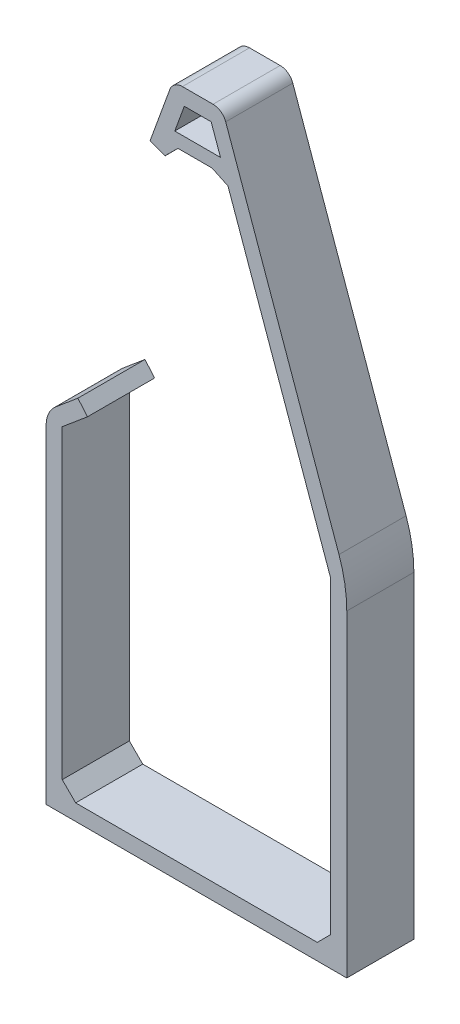
ISO-10303-21;
HEADER;
FILE_DESCRIPTION(('STEP AP214'),'2;1');
FILE_NAME('part.step','',(''),(''),'','','');
FILE_SCHEMA(('AUTOMOTIVE_DESIGN { 1 0 10303 214 1 1 1 1 }'));
ENDSEC;
DATA;
#1=APPLICATION_CONTEXT('core data for automotive mechanical design processes');
#2=APPLICATION_PROTOCOL_DEFINITION('international standard','automotive_design',2000,#1);
#3=PRODUCT_CONTEXT('',#1,'mechanical');
#4=PRODUCT('Part','Part','',(#3));
#5=PRODUCT_RELATED_PRODUCT_CATEGORY('part','',(#4));
#6=PRODUCT_DEFINITION_FORMATION('','',#4);
#7=PRODUCT_DEFINITION_CONTEXT('part definition',#1,'design');
#8=PRODUCT_DEFINITION('design','',#6,#7);
#9=PRODUCT_DEFINITION_SHAPE('','',#8);
#10=(LENGTH_UNIT() NAMED_UNIT(*) SI_UNIT(.MILLI.,.METRE.));
#11=(NAMED_UNIT(*) PLANE_ANGLE_UNIT() SI_UNIT($,.RADIAN.));
#12=(NAMED_UNIT(*) SI_UNIT($,.STERADIAN.) SOLID_ANGLE_UNIT());
#13=UNCERTAINTY_MEASURE_WITH_UNIT(LENGTH_MEASURE(1.E-05),#10,'distance_accuracy_value','');
#14=(GEOMETRIC_REPRESENTATION_CONTEXT(3) GLOBAL_UNCERTAINTY_ASSIGNED_CONTEXT((#13)) GLOBAL_UNIT_ASSIGNED_CONTEXT((#10,
#11,#12)) REPRESENTATION_CONTEXT('',''));
#15=CARTESIAN_POINT('',(0.,0.,0.));
#16=DIRECTION('',(0.,0.,1.));
#17=DIRECTION('',(1.,0.,0.));
#18=AXIS2_PLACEMENT_3D('',#15,#16,#17);
#19=CARTESIAN_POINT('',(-44.5218730063793,245.,25.));
#20=DIRECTION('',(-0.942030359041404,-0.335527648107162,0.));
#21=DIRECTION('',(0.335527648107162,-0.942030359041404,0.));
#22=AXIS2_PLACEMENT_3D('',#19,#20,#21);
#23=PLANE('',#22);
#24=DIRECTION('',(0.,0.,1.));
#25=VECTOR('',#24,1.);
#26=CARTESIAN_POINT('',(-41.0411868754266,235.227595179862,-21.2332268406788));
#27=LINE('',#26,#25);
#28=CARTESIAN_POINT('',(-41.0411868754266,235.227595179862,0.));
#29=VERTEX_POINT('',#28);
#30=CARTESIAN_POINT('',(-41.0411868754266,235.227595179862,25.));
#31=VERTEX_POINT('',#30);
#32=EDGE_CURVE('E302',#29,#31,#27,.T.);
#33=ORIENTED_EDGE('',*,*,#32,.T.);
#34=DIRECTION('',(-0.335527648107162,0.942030359041404,0.));
#35=VECTOR('',#34,1.);
#36=CARTESIAN_POINT('',(-44.5218730063793,245.,25.));
#37=LINE('',#36,#35);
#38=CARTESIAN_POINT('',(-44.5218730063793,245.,25.));
#39=VERTEX_POINT('',#38);
#40=EDGE_CURVE('E320',#31,#39,#37,.T.);
#41=ORIENTED_EDGE('',*,*,#40,.T.);
#42=DIRECTION('',(0.,0.,-1.));
#43=VECTOR('',#42,1.);
#44=CARTESIAN_POINT('',(-44.5218730063793,245.,25.));
#45=LINE('',#44,#43);
#46=CARTESIAN_POINT('',(-44.5218730063793,245.,0.));
#47=VERTEX_POINT('',#46);
#48=EDGE_CURVE('E354',#39,#47,#45,.T.);
#49=ORIENTED_EDGE('',*,*,#48,.T.);
#50=DIRECTION('',(-0.335527648107162,0.942030359041404,0.));
#51=VECTOR('',#50,1.);
#52=CARTESIAN_POINT('',(-44.5218730063793,245.,0.));
#53=LINE('',#52,#51);
#54=EDGE_CURVE('E337',#29,#47,#53,.T.);
#55=ORIENTED_EDGE('',*,*,#54,.F.);
#56=EDGE_LOOP('',(#33,#41,#49,#55));
#57=FACE_BOUND('',#56,.T.);
#58=ADVANCED_FACE('F73',(#57),#23,.T.);
#59=CARTESIAN_POINT('',(-100.,120.,25.));
#60=DIRECTION('',(0.939736472691457,-0.341899637164794,0.));
#61=DIRECTION('',(0.341899637164794,0.939736472691458,0.));
#62=AXIS2_PLACEMENT_3D('',#59,#60,#61);
#63=PLANE('',#62);
#64=DIRECTION('',(0.,0.,1.));
#65=VECTOR('',#64,1.);
#66=CARTESIAN_POINT('',(-58.0773183459256,235.227595179862,-21.2332268406788));
#67=LINE('',#66,#65);
#68=CARTESIAN_POINT('',(-58.0773183459256,235.227595179862,0.));
#69=VERTEX_POINT('',#68);
#70=CARTESIAN_POINT('',(-58.0773183459256,235.227595179862,25.));
#71=VERTEX_POINT('',#70);
#72=EDGE_CURVE('E296',#69,#71,#67,.T.);
#73=ORIENTED_EDGE('',*,*,#72,.F.);
#74=DIRECTION('',(-0.341899637164794,-0.939736472691457,0.));
#75=VECTOR('',#74,1.);
#76=CARTESIAN_POINT('',(-100.,120.,0.));
#77=LINE('',#76,#75);
#78=CARTESIAN_POINT('',(-54.5218730063793,245.,0.));
#79=VERTEX_POINT('',#78);
#80=EDGE_CURVE('E345',#79,#69,#77,.T.);
#81=ORIENTED_EDGE('',*,*,#80,.F.);
#82=DIRECTION('',(0.,0.,-1.));
#83=VECTOR('',#82,1.);
#84=CARTESIAN_POINT('',(-54.5218730063793,245.,25.));
#85=LINE('',#84,#83);
#86=CARTESIAN_POINT('',(-54.5218730063793,245.,25.));
#87=VERTEX_POINT('',#86);
#88=EDGE_CURVE('E335',#87,#79,#85,.T.);
#89=ORIENTED_EDGE('',*,*,#88,.F.);
#90=DIRECTION('',(-0.341899637164794,-0.939736472691457,0.));
#91=VECTOR('',#90,1.);
#92=CARTESIAN_POINT('',(-100.,120.,25.));
#93=LINE('',#92,#91);
#94=EDGE_CURVE('E328',#87,#71,#93,.T.);
#95=ORIENTED_EDGE('',*,*,#94,.T.);
#96=EDGE_LOOP('',(#73,#81,#89,#95));
#97=FACE_BOUND('',#96,.T.);
#98=ADVANCED_FACE('F570',(#97),#63,.T.);
#99=CARTESIAN_POINT('',(0.,0.,25.));
#100=DIRECTION('',(0.,0.,1.));
#101=DIRECTION('',(1.,0.,0.));
#102=AXIS2_PLACEMENT_3D('',#99,#100,#101);
#103=PLANE('',#102);
#104=ORIENTED_EDGE('',*,*,#40,.F.);
#105=DIRECTION('',(-1.,0.,0.));
#106=VECTOR('',#105,1.);
#107=CARTESIAN_POINT('',(-58.0773183459256,235.227595179862,25.));
#108=LINE('',#107,#106);
#109=EDGE_CURVE('E299',#31,#71,#108,.T.);
#110=ORIENTED_EDGE('',*,*,#109,.T.);
#111=ORIENTED_EDGE('',*,*,#94,.F.);
#112=DIRECTION('',(-1.,0.,0.));
#113=VECTOR('',#112,1.);
#114=CARTESIAN_POINT('',(-54.5218730063793,245.,25.));
#115=LINE('',#114,#113);
#116=EDGE_CURVE('E325',#39,#87,#115,.T.);
#117=ORIENTED_EDGE('',*,*,#116,.F.);
#118=EDGE_LOOP('',(#104,#110,#111,#117));
#119=FACE_BOUND('',#118,.T.);
#120=DIRECTION('',(-0.765962007675124,-0.642885839631184,0.));
#121=VECTOR('',#120,1.);
#122=CARTESIAN_POINT('',(-106.,121.057565216651,25.));
#123=LINE('',#122,#121);
#124=CARTESIAN_POINT('',(-94.163375331354,130.99225951252,25.));
#125=VERTEX_POINT('',#124);
#126=CARTESIAN_POINT('',(-102.428858396312,124.054889294509,25.));
#127=VERTEX_POINT('',#126);
#128=EDGE_CURVE('E271',#125,#127,#123,.T.);
#129=ORIENTED_EDGE('',*,*,#128,.T.);
#130=CARTESIAN_POINT('',(-96.,116.395269217758,25.));
#131=DIRECTION('',(0.,0.,1.));
#132=DIRECTION('',(1.,0.,0.));
#133=AXIS2_PLACEMENT_3D('',#130,#131,#132);
#134=CIRCLE('',#133,10.);
#135=CARTESIAN_POINT('',(-106.,116.395269217758,25.));
#136=VERTEX_POINT('',#135);
#137=EDGE_CURVE('E453',#127,#136,#134,.T.);
#138=ORIENTED_EDGE('',*,*,#137,.T.);
#139=DIRECTION('',(0.,-1.,0.));
#140=VECTOR('',#139,1.);
#141=CARTESIAN_POINT('',(-106.,0.,25.));
#142=LINE('',#141,#140);
#143=CARTESIAN_POINT('',(-106.,-6.00000000000001,25.));
#144=VERTEX_POINT('',#143);
#145=EDGE_CURVE('E373',#136,#144,#142,.T.);
#146=ORIENTED_EDGE('',*,*,#145,.T.);
#147=DIRECTION('',(1.,0.,0.));
#148=VECTOR('',#147,1.);
#149=CARTESIAN_POINT('',(0.,-6.,25.));
#150=LINE('',#149,#148);
#151=CARTESIAN_POINT('',(6.,-6.,25.));
#152=VERTEX_POINT('',#151);
#153=EDGE_CURVE('E375',#144,#152,#150,.T.);
#154=ORIENTED_EDGE('',*,*,#153,.T.);
#155=DIRECTION('',(0.,1.,0.));
#156=VECTOR('',#155,1.);
#157=CARTESIAN_POINT('',(6.,0.,25.));
#158=LINE('',#157,#156);
#159=CARTESIAN_POINT('',(6.,112.39805060308,25.));
#160=VERTEX_POINT('',#159);
#161=EDGE_CURVE('E361',#152,#160,#158,.T.);
#162=ORIENTED_EDGE('',*,*,#161,.T.);
#163=CARTESIAN_POINT('',(-44.,112.39805060308,25.));
#164=DIRECTION('',(0.,0.,1.));
#165=DIRECTION('',(1.,0.,0.));
#166=AXIS2_PLACEMENT_3D('',#163,#164,#165);
#167=CIRCLE('',#166,50.);
#168=CARTESIAN_POINT('',(3.10151795207019,129.174433008438,25.));
#169=VERTEX_POINT('',#168);
#170=EDGE_CURVE('E408',#160,#169,#167,.T.);
#171=ORIENTED_EDGE('',*,*,#170,.T.);
#172=DIRECTION('',(-0.335527648107162,0.942030359041404,0.));
#173=VECTOR('',#172,1.);
#174=CARTESIAN_POINT('',(43.5814498520134,15.5226222059618,25.));
#175=LINE('',#174,#173);
#176=CARTESIAN_POINT('',(-39.1063592814687,247.677638240536,25.));
#177=VERTEX_POINT('',#176);
#178=EDGE_CURVE('E364',#169,#177,#175,.T.);
#179=ORIENTED_EDGE('',*,*,#178,.T.);
#180=CARTESIAN_POINT('',(-43.8165110766757,246.,25.));
#181=DIRECTION('',(0.,0.,1.));
#182=DIRECTION('',(1.,0.,0.));
#183=AXIS2_PLACEMENT_3D('',#180,#181,#182);
#184=CIRCLE('',#183,5.);
#185=CARTESIAN_POINT('',(-43.8165110766757,251.,25.));
#186=VERTEX_POINT('',#185);
#187=EDGE_CURVE('E423',#177,#186,#184,.T.);
#188=ORIENTED_EDGE('',*,*,#187,.T.);
#189=DIRECTION('',(-1.,0.,0.));
#190=VECTOR('',#189,1.);
#191=CARTESIAN_POINT('',(0.,251.,25.));
#192=LINE('',#191,#190);
#193=CARTESIAN_POINT('',(-55.2221761040662,251.,25.));
#194=VERTEX_POINT('',#193);
#195=EDGE_CURVE('E368',#186,#194,#192,.T.);
#196=ORIENTED_EDGE('',*,*,#195,.T.);
#197=CARTESIAN_POINT('',(-55.2221761040662,246.,25.));
#198=DIRECTION('',(0.,0.,1.));
#199=DIRECTION('',(1.,0.,0.));
#200=AXIS2_PLACEMENT_3D('',#197,#198,#199);
#201=CIRCLE('',#200,5.);
#202=CARTESIAN_POINT('',(-59.9208584675235,247.709498185824,25.));
#203=VERTEX_POINT('',#202);
#204=EDGE_CURVE('E421',#194,#203,#201,.T.);
#205=ORIENTED_EDGE('',*,*,#204,.T.);
#206=DIRECTION('',(-0.341899637164794,-0.939736472691458,0.));
#207=VECTOR('',#206,1.);
#208=CARTESIAN_POINT('',(-132.504349732055,48.2083971545722,25.));
#209=LINE('',#208,#207);
#210=CARTESIAN_POINT('',(-67.2711825216207,227.506588182714,25.));
#211=VERTEX_POINT('',#210);
#212=EDGE_CURVE('E371',#203,#211,#209,.T.);
#213=ORIENTED_EDGE('',*,*,#212,.T.);
#214=DIRECTION('',(-0.939736472691457,0.341899637164794,0.));
#215=VECTOR('',#214,1.);
#216=CARTESIAN_POINT('',(-57.8738177947061,224.087591811066,25.));
#217=LINE('',#216,#215);
#218=CARTESIAN_POINT('',(-61.6327636854719,225.455190359725,25.));
#219=VERTEX_POINT('',#218);
#220=EDGE_CURVE('E311',#219,#211,#217,.T.);
#221=ORIENTED_EDGE('',*,*,#220,.F.);
#222=CARTESIAN_POINT('',(-61.612127121525,225.511911484008,25.));
#223=VERTEX_POINT('',#222);
#224=EDGE_CURVE('E327',#223,#219,#93,.T.);
#225=ORIENTED_EDGE('',*,*,#224,.F.);
#226=DIRECTION('',(-0.707106781186548,-0.707106781186547,0.));
#227=VECTOR('',#226,1.);
#228=CARTESIAN_POINT('',(-61.612127121525,225.511911484008,25.));
#229=LINE('',#228,#227);
#230=CARTESIAN_POINT('',(-56.8964434256704,230.227595179862,25.));
#231=VERTEX_POINT('',#230);
#232=EDGE_CURVE('E442',#223,#231,#229,.F.);
#233=ORIENTED_EDGE('',*,*,#232,.T.);
#234=DIRECTION('',(1.,0.,0.));
#235=VECTOR('',#234,1.);
#236=CARTESIAN_POINT('',(-39.2603119551714,230.227595179862,25.));
#237=LINE('',#236,#235);
#238=CARTESIAN_POINT('',(-44.206703695744,230.227595179862,25.));
#239=VERTEX_POINT('',#238);
#240=EDGE_CURVE('E291',#231,#239,#237,.T.);
#241=ORIENTED_EDGE('',*,*,#240,.T.);
#242=DIRECTION('',(-0.903369930213925,0.428862179709622,0.));
#243=VECTOR('',#242,1.);
#244=CARTESIAN_POINT('',(-44.206703695744,230.227595179862,25.));
#245=LINE('',#244,#243);
#246=CARTESIAN_POINT('',(-38.2537290108499,227.401504102738,25.));
#247=VERTEX_POINT('',#246);
#248=EDGE_CURVE('E438',#239,#247,#245,.F.);
#249=ORIENTED_EDGE('',*,*,#248,.T.);
#250=CARTESIAN_POINT('',(0.,120.,25.));
#251=VERTEX_POINT('',#250);
#252=EDGE_CURVE('E322',#251,#247,#37,.T.);
#253=ORIENTED_EDGE('',*,*,#252,.F.);
#254=DIRECTION('',(0.,1.,0.));
#255=VECTOR('',#254,1.);
#256=CARTESIAN_POINT('',(0.,0.,25.));
#257=LINE('',#256,#255);
#258=CARTESIAN_POINT('',(0.,5.,25.));
#259=VERTEX_POINT('',#258);
#260=EDGE_CURVE('E318',#259,#251,#257,.T.);
#261=ORIENTED_EDGE('',*,*,#260,.F.);
#262=DIRECTION('',(0.707106781186551,0.707106781186544,0.));
#263=VECTOR('',#262,1.);
#264=CARTESIAN_POINT('',(-5.00000000000006,0.,25.));
#265=LINE('',#264,#263);
#266=CARTESIAN_POINT('',(-5.00000000000006,0.,25.));
#267=VERTEX_POINT('',#266);
#268=EDGE_CURVE('E466',#259,#267,#265,.F.);
#269=ORIENTED_EDGE('',*,*,#268,.T.);
#270=DIRECTION('',(1.,0.,0.));
#271=VECTOR('',#270,1.);
#272=CARTESIAN_POINT('',(0.,0.,25.));
#273=LINE('',#272,#271);
#274=CARTESIAN_POINT('',(-95.,0.,25.));
#275=VERTEX_POINT('',#274);
#276=EDGE_CURVE('E332',#275,#267,#273,.T.);
#277=ORIENTED_EDGE('',*,*,#276,.F.);
#278=DIRECTION('',(0.707106781186544,-0.707106781186551,0.));
#279=VECTOR('',#278,1.);
#280=CARTESIAN_POINT('',(-100.,5.00000000000002,25.));
#281=LINE('',#280,#279);
#282=CARTESIAN_POINT('',(-100.,5.00000000000002,25.));
#283=VERTEX_POINT('',#282);
#284=EDGE_CURVE('E12',#275,#283,#281,.F.);
#285=ORIENTED_EDGE('',*,*,#284,.T.);
#286=DIRECTION('',(0.,-1.,0.));
#287=VECTOR('',#286,1.);
#288=CARTESIAN_POINT('',(-100.,0.,25.));
#289=LINE('',#288,#287);
#290=CARTESIAN_POINT('',(-100.,118.874615120958,25.));
#291=VERTEX_POINT('',#290);
#292=EDGE_CURVE('E281',#291,#283,#289,.T.);
#293=ORIENTED_EDGE('',*,*,#292,.F.);
#294=DIRECTION('',(0.765962007675123,0.642885839631186,0.));
#295=VECTOR('',#294,1.);
#296=CARTESIAN_POINT('',(-90.6086204503863,126.756970729396,25.));
#297=LINE('',#296,#295);
#298=CARTESIAN_POINT('',(-90.6086204503863,126.756970729396,25.));
#299=VERTEX_POINT('',#298);
#300=EDGE_CURVE('E265',#291,#299,#297,.T.);
#301=ORIENTED_EDGE('',*,*,#300,.T.);
#302=DIRECTION('',(-0.642885839631183,0.765962007675125,0.));
#303=VECTOR('',#302,1.);
#304=CARTESIAN_POINT('',(-94.163375331354,130.99225951252,25.));
#305=LINE('',#304,#303);
#306=EDGE_CURVE('E274',#299,#125,#305,.T.);
#307=ORIENTED_EDGE('',*,*,#306,.T.);
#308=EDGE_LOOP('',(#129,#138,#146,#154,#162,#171,#179,#188,#196,#205,#213,#221,#225,#233,#241,
#249,#253,#261,#269,#277,#285,#293,#301,#307));
#309=FACE_BOUND('',#308,.T.);
#310=ADVANCED_FACE('F280',(#119,#309),#103,.T.);
#311=CARTESIAN_POINT('',(0.,0.,0.));
#312=DIRECTION('',(0.,0.,1.));
#313=DIRECTION('',(1.,0.,0.));
#314=AXIS2_PLACEMENT_3D('',#311,#312,#313);
#315=PLANE('',#314);
#316=DIRECTION('',(0.,-1.,0.));
#317=VECTOR('',#316,1.);
#318=CARTESIAN_POINT('',(-106.,0.,0.));
#319=LINE('',#318,#317);
#320=CARTESIAN_POINT('',(-106.,116.395269217758,0.));
#321=VERTEX_POINT('',#320);
#322=CARTESIAN_POINT('',(-106.,-6.00000000000001,0.));
#323=VERTEX_POINT('',#322);
#324=EDGE_CURVE('E388',#321,#323,#319,.T.);
#325=ORIENTED_EDGE('',*,*,#324,.F.);
#326=CARTESIAN_POINT('',(-96.,116.395269217758,0.));
#327=DIRECTION('',(0.,0.,1.));
#328=DIRECTION('',(1.,0.,0.));
#329=AXIS2_PLACEMENT_3D('',#326,#327,#328);
#330=CIRCLE('',#329,10.);
#331=CARTESIAN_POINT('',(-102.428858396312,124.054889294509,0.));
#332=VERTEX_POINT('',#331);
#333=EDGE_CURVE('E449',#321,#332,#330,.F.);
#334=ORIENTED_EDGE('',*,*,#333,.T.);
#335=DIRECTION('',(0.765962007675124,0.642885839631184,0.));
#336=VECTOR('',#335,1.);
#337=CARTESIAN_POINT('',(-106.,121.057565216651,0.));
#338=LINE('',#337,#336);
#339=CARTESIAN_POINT('',(-94.163375331354,130.99225951252,0.));
#340=VERTEX_POINT('',#339);
#341=EDGE_CURVE('E284',#332,#340,#338,.T.);
#342=ORIENTED_EDGE('',*,*,#341,.T.);
#343=DIRECTION('',(0.642885839631183,-0.765962007675126,0.));
#344=VECTOR('',#343,1.);
#345=CARTESIAN_POINT('',(-94.163375331354,130.99225951252,0.));
#346=LINE('',#345,#344);
#347=CARTESIAN_POINT('',(-90.6086204503863,126.756970729396,0.));
#348=VERTEX_POINT('',#347);
#349=EDGE_CURVE('E288',#340,#348,#346,.T.);
#350=ORIENTED_EDGE('',*,*,#349,.T.);
#351=DIRECTION('',(-0.765962007675123,-0.642885839631186,0.));
#352=VECTOR('',#351,1.);
#353=CARTESIAN_POINT('',(-90.6086204503863,126.756970729396,0.));
#354=LINE('',#353,#352);
#355=CARTESIAN_POINT('',(-100.,118.874615120958,0.));
#356=VERTEX_POINT('',#355);
#357=EDGE_CURVE('E267',#348,#356,#354,.T.);
#358=ORIENTED_EDGE('',*,*,#357,.T.);
#359=DIRECTION('',(0.,-1.,0.));
#360=VECTOR('',#359,1.);
#361=CARTESIAN_POINT('',(-100.,0.,0.));
#362=LINE('',#361,#360);
#363=CARTESIAN_POINT('',(-100.,5.00000000000002,0.));
#364=VERTEX_POINT('',#363);
#365=EDGE_CURVE('E348',#356,#364,#362,.T.);
#366=ORIENTED_EDGE('',*,*,#365,.T.);
#367=DIRECTION('',(-0.707106781186544,0.707106781186551,0.));
#368=VECTOR('',#367,1.);
#369=CARTESIAN_POINT('',(-47.5000000000005,-47.5,0.));
#370=LINE('',#369,#368);
#371=CARTESIAN_POINT('',(-95.,0.,0.));
#372=VERTEX_POINT('',#371);
#373=EDGE_CURVE('E82',#364,#372,#370,.F.);
#374=ORIENTED_EDGE('',*,*,#373,.T.);
#375=DIRECTION('',(1.,0.,0.));
#376=VECTOR('',#375,1.);
#377=CARTESIAN_POINT('',(0.,0.,0.));
#378=LINE('',#377,#376);
#379=CARTESIAN_POINT('',(-5.00000000000006,0.,0.));
#380=VERTEX_POINT('',#379);
#381=EDGE_CURVE('E321',#372,#380,#378,.T.);
#382=ORIENTED_EDGE('',*,*,#381,.T.);
#383=DIRECTION('',(-0.707106781186551,-0.707106781186544,0.));
#384=VECTOR('',#383,1.);
#385=CARTESIAN_POINT('',(-2.5,2.50000000000003,0.));
#386=LINE('',#385,#384);
#387=CARTESIAN_POINT('',(0.,5.,0.));
#388=VERTEX_POINT('',#387);
#389=EDGE_CURVE('E464',#380,#388,#386,.F.);
#390=ORIENTED_EDGE('',*,*,#389,.T.);
#391=DIRECTION('',(0.,1.,0.));
#392=VECTOR('',#391,1.);
#393=CARTESIAN_POINT('',(0.,0.,0.));
#394=LINE('',#393,#392);
#395=CARTESIAN_POINT('',(0.,120.,0.));
#396=VERTEX_POINT('',#395);
#397=EDGE_CURVE('E315',#388,#396,#394,.T.);
#398=ORIENTED_EDGE('',*,*,#397,.T.);
#399=CARTESIAN_POINT('',(-38.2537290108499,227.401504102738,0.));
#400=VERTEX_POINT('',#399);
#401=EDGE_CURVE('E338',#396,#400,#53,.T.);
#402=ORIENTED_EDGE('',*,*,#401,.T.);
#403=DIRECTION('',(0.903369930213925,-0.428862179709622,0.));
#404=VECTOR('',#403,1.);
#405=CARTESIAN_POINT('',(81.0644312286248,170.75688425456,0.));
#406=LINE('',#405,#404);
#407=CARTESIAN_POINT('',(-44.206703695744,230.227595179862,0.));
#408=VERTEX_POINT('',#407);
#409=EDGE_CURVE('E440',#400,#408,#406,.F.);
#410=ORIENTED_EDGE('',*,*,#409,.T.);
#411=DIRECTION('',(-1.,0.,0.));
#412=VECTOR('',#411,1.);
#413=CARTESIAN_POINT('',(-39.2603119551714,230.227595179862,0.));
#414=LINE('',#413,#412);
#415=CARTESIAN_POINT('',(-56.8964434256704,230.227595179862,0.));
#416=VERTEX_POINT('',#415);
#417=EDGE_CURVE('E295',#408,#416,#414,.T.);
#418=ORIENTED_EDGE('',*,*,#417,.T.);
#419=DIRECTION('',(0.707106781186548,0.707106781186547,0.));
#420=VECTOR('',#419,1.);
#421=CARTESIAN_POINT('',(-143.562019302766,143.562019302767,0.));
#422=LINE('',#421,#420);
#423=CARTESIAN_POINT('',(-61.612127121525,225.511911484008,0.));
#424=VERTEX_POINT('',#423);
#425=EDGE_CURVE('E444',#416,#424,#422,.F.);
#426=ORIENTED_EDGE('',*,*,#425,.T.);
#427=CARTESIAN_POINT('',(-61.6327636854719,225.455190359725,0.));
#428=VERTEX_POINT('',#427);
#429=EDGE_CURVE('E344',#424,#428,#77,.T.);
#430=ORIENTED_EDGE('',*,*,#429,.T.);
#431=DIRECTION('',(-0.939736472691457,0.341899637164794,0.));
#432=VECTOR('',#431,1.);
#433=CARTESIAN_POINT('',(-57.8738177947061,224.087591811066,0.));
#434=LINE('',#433,#432);
#435=CARTESIAN_POINT('',(-67.2711825216207,227.506588182714,0.));
#436=VERTEX_POINT('',#435);
#437=EDGE_CURVE('E312',#428,#436,#434,.T.);
#438=ORIENTED_EDGE('',*,*,#437,.T.);
#439=DIRECTION('',(-0.341899637164794,-0.939736472691458,0.));
#440=VECTOR('',#439,1.);
#441=CARTESIAN_POINT('',(-132.504349732055,48.2083971545722,0.));
#442=LINE('',#441,#440);
#443=CARTESIAN_POINT('',(-59.9208584675235,247.709498185824,0.));
#444=VERTEX_POINT('',#443);
#445=EDGE_CURVE('E386',#444,#436,#442,.T.);
#446=ORIENTED_EDGE('',*,*,#445,.F.);
#447=CARTESIAN_POINT('',(-55.2221761040662,246.,0.));
#448=DIRECTION('',(0.,0.,1.));
#449=DIRECTION('',(1.,0.,0.));
#450=AXIS2_PLACEMENT_3D('',#447,#448,#449);
#451=CIRCLE('',#450,5.);
#452=CARTESIAN_POINT('',(-55.2221761040662,251.,0.));
#453=VERTEX_POINT('',#452);
#454=EDGE_CURVE('E415',#444,#453,#451,.F.);
#455=ORIENTED_EDGE('',*,*,#454,.T.);
#456=DIRECTION('',(-1.,0.,0.));
#457=VECTOR('',#456,1.);
#458=CARTESIAN_POINT('',(0.,251.,0.));
#459=LINE('',#458,#457);
#460=CARTESIAN_POINT('',(-43.8165110766757,251.,0.));
#461=VERTEX_POINT('',#460);
#462=EDGE_CURVE('E383',#461,#453,#459,.T.);
#463=ORIENTED_EDGE('',*,*,#462,.F.);
#464=CARTESIAN_POINT('',(-43.8165110766757,246.,0.));
#465=DIRECTION('',(0.,0.,1.));
#466=DIRECTION('',(1.,0.,0.));
#467=AXIS2_PLACEMENT_3D('',#464,#465,#466);
#468=CIRCLE('',#467,5.);
#469=CARTESIAN_POINT('',(-39.1063592814687,247.677638240536,0.));
#470=VERTEX_POINT('',#469);
#471=EDGE_CURVE('E417',#461,#470,#468,.F.);
#472=ORIENTED_EDGE('',*,*,#471,.T.);
#473=DIRECTION('',(-0.335527648107162,0.942030359041404,0.));
#474=VECTOR('',#473,1.);
#475=CARTESIAN_POINT('',(43.5814498520134,15.5226222059618,0.));
#476=LINE('',#475,#474);
#477=CARTESIAN_POINT('',(3.10151795207019,129.174433008438,0.));
#478=VERTEX_POINT('',#477);
#479=EDGE_CURVE('E380',#478,#470,#476,.T.);
#480=ORIENTED_EDGE('',*,*,#479,.F.);
#481=CARTESIAN_POINT('',(-44.,112.39805060308,0.));
#482=DIRECTION('',(0.,0.,1.));
#483=DIRECTION('',(1.,0.,0.));
#484=AXIS2_PLACEMENT_3D('',#481,#482,#483);
#485=CIRCLE('',#484,50.);
#486=CARTESIAN_POINT('',(6.,112.39805060308,0.));
#487=VERTEX_POINT('',#486);
#488=EDGE_CURVE('E404',#478,#487,#485,.F.);
#489=ORIENTED_EDGE('',*,*,#488,.T.);
#490=DIRECTION('',(0.,1.,0.));
#491=VECTOR('',#490,1.);
#492=CARTESIAN_POINT('',(6.,0.,0.));
#493=LINE('',#492,#491);
#494=CARTESIAN_POINT('',(6.,-6.,0.));
#495=VERTEX_POINT('',#494);
#496=EDGE_CURVE('E360',#495,#487,#493,.T.);
#497=ORIENTED_EDGE('',*,*,#496,.F.);
#498=DIRECTION('',(1.,0.,0.));
#499=VECTOR('',#498,1.);
#500=CARTESIAN_POINT('',(0.,-6.,0.));
#501=LINE('',#500,#499);
#502=EDGE_CURVE('E365',#323,#495,#501,.T.);
#503=ORIENTED_EDGE('',*,*,#502,.F.);
#504=EDGE_LOOP('',(#325,#334,#342,#350,#358,#366,#374,#382,#390,#398,#402,#410,#418,#426,#430,
#438,#446,#455,#463,#472,#480,#489,#497,#503));
#505=FACE_BOUND('',#504,.T.);
#506=ORIENTED_EDGE('',*,*,#80,.T.);
#507=DIRECTION('',(1.,0.,0.));
#508=VECTOR('',#507,1.);
#509=CARTESIAN_POINT('',(-58.0773183459256,235.227595179862,0.));
#510=LINE('',#509,#508);
#511=EDGE_CURVE('E292',#69,#29,#510,.T.);
#512=ORIENTED_EDGE('',*,*,#511,.T.);
#513=ORIENTED_EDGE('',*,*,#54,.T.);
#514=DIRECTION('',(-1.,0.,0.));
#515=VECTOR('',#514,1.);
#516=CARTESIAN_POINT('',(-54.5218730063793,245.,0.));
#517=LINE('',#516,#515);
#518=EDGE_CURVE('E341',#47,#79,#517,.T.);
#519=ORIENTED_EDGE('',*,*,#518,.T.);
#520=EDGE_LOOP('',(#506,#512,#513,#519));
#521=FACE_BOUND('',#520,.T.);
#522=ADVANCED_FACE('F470',(#505,#521),#315,.F.);
#523=CARTESIAN_POINT('',(6.,0.,25.));
#524=DIRECTION('',(-1.,0.,0.));
#525=DIRECTION('',(0.,0.,1.));
#526=AXIS2_PLACEMENT_3D('',#523,#524,#525);
#527=PLANE('',#526);
#528=ORIENTED_EDGE('',*,*,#496,.T.);
#529=DIRECTION('',(0.,0.,-1.));
#530=VECTOR('',#529,1.);
#531=CARTESIAN_POINT('',(6.,112.39805060308,25.));
#532=LINE('',#531,#530);
#533=EDGE_CURVE('E406',#487,#160,#532,.F.);
#534=ORIENTED_EDGE('',*,*,#533,.T.);
#535=ORIENTED_EDGE('',*,*,#161,.F.);
#536=DIRECTION('',(0.,0.,-1.));
#537=VECTOR('',#536,1.);
#538=CARTESIAN_POINT('',(6.,-6.,25.));
#539=LINE('',#538,#537);
#540=EDGE_CURVE('E377',#152,#495,#539,.T.);
#541=ORIENTED_EDGE('',*,*,#540,.T.);
#542=EDGE_LOOP('',(#528,#534,#535,#541));
#543=FACE_BOUND('',#542,.T.);
#544=ADVANCED_FACE('F497',(#543),#527,.F.);
#545=CARTESIAN_POINT('',(43.5814498520134,15.5226222059618,25.));
#546=DIRECTION('',(-0.942030359041404,-0.335527648107162,0.));
#547=DIRECTION('',(0.335527648107162,-0.942030359041404,0.));
#548=AXIS2_PLACEMENT_3D('',#545,#546,#547);
#549=PLANE('',#548);
#550=ORIENTED_EDGE('',*,*,#479,.T.);
#551=DIRECTION('',(0.,0.,-1.));
#552=VECTOR('',#551,1.);
#553=CARTESIAN_POINT('',(-39.1063592814687,247.677638240536,25.));
#554=LINE('',#553,#552);
#555=EDGE_CURVE('E419',#470,#177,#554,.F.);
#556=ORIENTED_EDGE('',*,*,#555,.T.);
#557=ORIENTED_EDGE('',*,*,#178,.F.);
#558=DIRECTION('',(0.,0.,-1.));
#559=VECTOR('',#558,1.);
#560=CARTESIAN_POINT('',(3.10151795207019,129.174433008438,25.));
#561=LINE('',#560,#559);
#562=EDGE_CURVE('E401',#169,#478,#561,.T.);
#563=ORIENTED_EDGE('',*,*,#562,.T.);
#564=EDGE_LOOP('',(#550,#556,#557,#563));
#565=FACE_BOUND('',#564,.T.);
#566=ADVANCED_FACE('F506',(#565),#549,.F.);
#567=CARTESIAN_POINT('',(0.,251.,25.));
#568=DIRECTION('',(0.,-1.,0.));
#569=DIRECTION('',(0.,0.,-1.));
#570=AXIS2_PLACEMENT_3D('',#567,#568,#569);
#571=PLANE('',#570);
#572=ORIENTED_EDGE('',*,*,#195,.F.);
#573=DIRECTION('',(0.,0.,-1.));
#574=VECTOR('',#573,1.);
#575=CARTESIAN_POINT('',(-43.8165110766757,251.,25.));
#576=LINE('',#575,#574);
#577=EDGE_CURVE('E412',#186,#461,#576,.T.);
#578=ORIENTED_EDGE('',*,*,#577,.T.);
#579=ORIENTED_EDGE('',*,*,#462,.T.);
#580=DIRECTION('',(0.,0.,-1.));
#581=VECTOR('',#580,1.);
#582=CARTESIAN_POINT('',(-55.2221761040662,251.,25.));
#583=LINE('',#582,#581);
#584=EDGE_CURVE('E410',#453,#194,#583,.F.);
#585=ORIENTED_EDGE('',*,*,#584,.T.);
#586=EDGE_LOOP('',(#572,#578,#579,#585));
#587=FACE_BOUND('',#586,.T.);
#588=ADVANCED_FACE('F515',(#587),#571,.F.);
#589=CARTESIAN_POINT('',(-132.504349732055,48.2083971545722,25.));
#590=DIRECTION('',(0.939736472691457,-0.341899637164794,0.));
#591=DIRECTION('',(0.341899637164794,0.939736472691458,0.));
#592=AXIS2_PLACEMENT_3D('',#589,#590,#591);
#593=PLANE('',#592);
#594=ORIENTED_EDGE('',*,*,#212,.F.);
#595=DIRECTION('',(0.,0.,-1.));
#596=VECTOR('',#595,1.);
#597=CARTESIAN_POINT('',(-59.9208584675235,247.709498185824,25.));
#598=LINE('',#597,#596);
#599=EDGE_CURVE('E425',#203,#444,#598,.T.);
#600=ORIENTED_EDGE('',*,*,#599,.T.);
#601=ORIENTED_EDGE('',*,*,#445,.T.);
#602=DIRECTION('',(0.,0.,-1.));
#603=VECTOR('',#602,1.);
#604=CARTESIAN_POINT('',(-67.2711825216207,227.506588182714,0.));
#605=LINE('',#604,#603);
#606=EDGE_CURVE('E308',#211,#436,#605,.T.);
#607=ORIENTED_EDGE('',*,*,#606,.F.);
#608=EDGE_LOOP('',(#594,#600,#601,#607));
#609=FACE_BOUND('',#608,.T.);
#610=ADVANCED_FACE('F524',(#609),#593,.F.);
#611=CARTESIAN_POINT('',(-106.,0.,25.));
#612=DIRECTION('',(1.,0.,0.));
#613=DIRECTION('',(0.,0.,-1.));
#614=AXIS2_PLACEMENT_3D('',#611,#612,#613);
#615=PLANE('',#614);
#616=ORIENTED_EDGE('',*,*,#145,.F.);
#617=DIRECTION('',(0.,0.,-1.));
#618=VECTOR('',#617,1.);
#619=CARTESIAN_POINT('',(-106.,116.395269217758,0.));
#620=LINE('',#619,#618);
#621=EDGE_CURVE('E446',#136,#321,#620,.T.);
#622=ORIENTED_EDGE('',*,*,#621,.T.);
#623=ORIENTED_EDGE('',*,*,#324,.T.);
#624=DIRECTION('',(0.,0.,-1.));
#625=VECTOR('',#624,1.);
#626=CARTESIAN_POINT('',(-106.,-6.00000000000001,25.));
#627=LINE('',#626,#625);
#628=EDGE_CURVE('E393',#144,#323,#627,.T.);
#629=ORIENTED_EDGE('',*,*,#628,.F.);
#630=EDGE_LOOP('',(#616,#622,#623,#629));
#631=FACE_BOUND('',#630,.T.);
#632=ADVANCED_FACE('F487',(#631),#615,.F.);
#633=CARTESIAN_POINT('',(0.,-6.,25.));
#634=DIRECTION('',(0.,1.,0.));
#635=DIRECTION('',(-1.,0.,0.));
#636=AXIS2_PLACEMENT_3D('',#633,#634,#635);
#637=PLANE('',#636);
#638=ORIENTED_EDGE('',*,*,#502,.T.);
#639=ORIENTED_EDGE('',*,*,#540,.F.);
#640=ORIENTED_EDGE('',*,*,#153,.F.);
#641=ORIENTED_EDGE('',*,*,#628,.T.);
#642=EDGE_LOOP('',(#638,#639,#640,#641));
#643=FACE_BOUND('',#642,.T.);
#644=ADVANCED_FACE('F493',(#643),#637,.F.);
#645=CARTESIAN_POINT('',(0.,0.,25.));
#646=DIRECTION('',(-1.,0.,0.));
#647=DIRECTION('',(0.,0.,1.));
#648=AXIS2_PLACEMENT_3D('',#645,#646,#647);
#649=PLANE('',#648);
#650=ORIENTED_EDGE('',*,*,#397,.F.);
#651=DIRECTION('',(0.,0.,1.));
#652=VECTOR('',#651,1.);
#653=CARTESIAN_POINT('',(0.,5.,25.));
#654=LINE('',#653,#652);
#655=EDGE_CURVE('E460',#388,#259,#654,.T.);
#656=ORIENTED_EDGE('',*,*,#655,.T.);
#657=ORIENTED_EDGE('',*,*,#260,.T.);
#658=DIRECTION('',(0.,0.,-1.));
#659=VECTOR('',#658,1.);
#660=CARTESIAN_POINT('',(0.,120.,25.));
#661=LINE('',#660,#659);
#662=EDGE_CURVE('E357',#251,#396,#661,.T.);
#663=ORIENTED_EDGE('',*,*,#662,.T.);
#664=EDGE_LOOP('',(#650,#656,#657,#663));
#665=FACE_BOUND('',#664,.T.);
#666=ADVANCED_FACE('F557',(#665),#649,.T.);
#667=ORIENTED_EDGE('',*,*,#252,.T.);
#668=DIRECTION('',(0.,0.,-1.));
#669=VECTOR('',#668,1.);
#670=CARTESIAN_POINT('',(-38.2537290108499,227.401504102738,0.));
#671=LINE('',#670,#669);
#672=EDGE_CURVE('E433',#247,#400,#671,.T.);
#673=ORIENTED_EDGE('',*,*,#672,.T.);
#674=ORIENTED_EDGE('',*,*,#401,.F.);
#675=ORIENTED_EDGE('',*,*,#662,.F.);
#676=EDGE_LOOP('',(#667,#673,#674,#675));
#677=FACE_BOUND('',#676,.T.);
#678=ADVANCED_FACE('F553',(#677),#23,.T.);
#679=CARTESIAN_POINT('',(-54.5218730063793,245.,25.));
#680=DIRECTION('',(0.,-1.,0.));
#681=DIRECTION('',(0.,0.,-1.));
#682=AXIS2_PLACEMENT_3D('',#679,#680,#681);
#683=PLANE('',#682);
#684=ORIENTED_EDGE('',*,*,#518,.F.);
#685=ORIENTED_EDGE('',*,*,#48,.F.);
#686=ORIENTED_EDGE('',*,*,#116,.T.);
#687=ORIENTED_EDGE('',*,*,#88,.T.);
#688=EDGE_LOOP('',(#684,#685,#686,#687));
#689=FACE_BOUND('',#688,.T.);
#690=ADVANCED_FACE('F581',(#689),#683,.T.);
#691=ORIENTED_EDGE('',*,*,#429,.F.);
#692=DIRECTION('',(0.,0.,1.));
#693=VECTOR('',#692,1.);
#694=CARTESIAN_POINT('',(-61.612127121525,225.511911484008,25.));
#695=LINE('',#694,#693);
#696=EDGE_CURVE('E435',#424,#223,#695,.T.);
#697=ORIENTED_EDGE('',*,*,#696,.T.);
#698=ORIENTED_EDGE('',*,*,#224,.T.);
#699=DIRECTION('',(0.,0.,1.));
#700=VECTOR('',#699,1.);
#701=CARTESIAN_POINT('',(-61.6327636854719,225.455190359725,25.));
#702=LINE('',#701,#700);
#703=EDGE_CURVE('E398',#428,#219,#702,.T.);
#704=ORIENTED_EDGE('',*,*,#703,.F.);
#705=EDGE_LOOP('',(#691,#697,#698,#704));
#706=FACE_BOUND('',#705,.T.);
#707=ADVANCED_FACE('F533',(#706),#63,.T.);
#708=CARTESIAN_POINT('',(-100.,0.,25.));
#709=DIRECTION('',(1.,0.,0.));
#710=DIRECTION('',(0.,0.,-1.));
#711=AXIS2_PLACEMENT_3D('',#708,#709,#710);
#712=PLANE('',#711);
#713=ORIENTED_EDGE('',*,*,#292,.T.);
#714=DIRECTION('',(0.,0.,-1.));
#715=VECTOR('',#714,1.);
#716=CARTESIAN_POINT('',(-100.,5.00000000000002,0.));
#717=LINE('',#716,#715);
#718=EDGE_CURVE('E462',#283,#364,#717,.T.);
#719=ORIENTED_EDGE('',*,*,#718,.T.);
#720=ORIENTED_EDGE('',*,*,#365,.F.);
#721=DIRECTION('',(0.,0.,-1.));
#722=VECTOR('',#721,1.);
#723=CARTESIAN_POINT('',(-100.,118.874615120958,25.));
#724=LINE('',#723,#722);
#725=EDGE_CURVE('E396',#291,#356,#724,.T.);
#726=ORIENTED_EDGE('',*,*,#725,.F.);
#727=EDGE_LOOP('',(#713,#719,#720,#726));
#728=FACE_BOUND('',#727,.T.);
#729=ADVANCED_FACE('F476',(#728),#712,.T.);
#730=CARTESIAN_POINT('',(0.,0.,25.));
#731=DIRECTION('',(0.,1.,0.));
#732=DIRECTION('',(-1.,0.,0.));
#733=AXIS2_PLACEMENT_3D('',#730,#731,#732);
#734=PLANE('',#733);
#735=ORIENTED_EDGE('',*,*,#276,.T.);
#736=DIRECTION('',(0.,0.,-1.));
#737=VECTOR('',#736,1.);
#738=CARTESIAN_POINT('',(-5.00000000000006,0.,0.));
#739=LINE('',#738,#737);
#740=EDGE_CURVE('E457',#267,#380,#739,.T.);
#741=ORIENTED_EDGE('',*,*,#740,.T.);
#742=ORIENTED_EDGE('',*,*,#381,.F.);
#743=DIRECTION('',(0.,0.,1.));
#744=VECTOR('',#743,1.);
#745=CARTESIAN_POINT('',(-95.,0.,25.));
#746=LINE('',#745,#744);
#747=EDGE_CURVE('E455',#372,#275,#746,.T.);
#748=ORIENTED_EDGE('',*,*,#747,.T.);
#749=EDGE_LOOP('',(#735,#741,#742,#748));
#750=FACE_BOUND('',#749,.T.);
#751=ADVANCED_FACE('F473',(#750),#734,.T.);
#752=CARTESIAN_POINT('',(-57.8738177947061,224.087591811066,0.));
#753=DIRECTION('',(0.341899637164794,0.939736472691457,0.));
#754=DIRECTION('',(-0.939736472691457,0.341899637164794,0.));
#755=AXIS2_PLACEMENT_3D('',#752,#753,#754);
#756=PLANE('',#755);
#757=ORIENTED_EDGE('',*,*,#703,.T.);
#758=ORIENTED_EDGE('',*,*,#220,.T.);
#759=ORIENTED_EDGE('',*,*,#606,.T.);
#760=ORIENTED_EDGE('',*,*,#437,.F.);
#761=EDGE_LOOP('',(#757,#758,#759,#760));
#762=FACE_BOUND('',#761,.T.);
#763=ADVANCED_FACE('F530',(#762),#756,.F.);
#764=CARTESIAN_POINT('',(-58.0773183459256,235.227595179862,-21.2332268406788));
#765=DIRECTION('',(0.,1.,0.));
#766=DIRECTION('',(0.,0.,1.));
#767=AXIS2_PLACEMENT_3D('',#764,#765,#766);
#768=PLANE('',#767);
#769=ORIENTED_EDGE('',*,*,#511,.F.);
#770=ORIENTED_EDGE('',*,*,#72,.T.);
#771=ORIENTED_EDGE('',*,*,#109,.F.);
#772=ORIENTED_EDGE('',*,*,#32,.F.);
#773=EDGE_LOOP('',(#769,#770,#771,#772));
#774=FACE_BOUND('',#773,.T.);
#775=ADVANCED_FACE('F633',(#774),#768,.T.);
#776=CARTESIAN_POINT('',(-39.2603119551714,230.227595179862,-21.2332268406788));
#777=DIRECTION('',(0.,-1.,0.));
#778=DIRECTION('',(0.,0.,-1.));
#779=AXIS2_PLACEMENT_3D('',#776,#777,#778);
#780=PLANE('',#779);
#781=ORIENTED_EDGE('',*,*,#417,.F.);
#782=DIRECTION('',(0.,0.,1.));
#783=VECTOR('',#782,1.);
#784=CARTESIAN_POINT('',(-44.206703695744,230.227595179862,25.));
#785=LINE('',#784,#783);
#786=EDGE_CURVE('E430',#408,#239,#785,.T.);
#787=ORIENTED_EDGE('',*,*,#786,.T.);
#788=ORIENTED_EDGE('',*,*,#240,.F.);
#789=DIRECTION('',(0.,0.,-1.));
#790=VECTOR('',#789,1.);
#791=CARTESIAN_POINT('',(-56.8964434256704,230.227595179862,0.));
#792=LINE('',#791,#790);
#793=EDGE_CURVE('E428',#231,#416,#792,.T.);
#794=ORIENTED_EDGE('',*,*,#793,.T.);
#795=EDGE_LOOP('',(#781,#787,#788,#794));
#796=FACE_BOUND('',#795,.T.);
#797=ADVANCED_FACE('F541',(#796),#780,.T.);
#798=CARTESIAN_POINT('',(-44.,112.39805060308,25.));
#799=DIRECTION('',(0.,0.,-1.));
#800=DIRECTION('',(-1.,0.,0.));
#801=AXIS2_PLACEMENT_3D('',#798,#799,#800);
#802=CYLINDRICAL_SURFACE('',#801,50.);
#803=ORIENTED_EDGE('',*,*,#170,.F.);
#804=ORIENTED_EDGE('',*,*,#533,.F.);
#805=ORIENTED_EDGE('',*,*,#488,.F.);
#806=ORIENTED_EDGE('',*,*,#562,.F.);
#807=EDGE_LOOP('',(#803,#804,#805,#806));
#808=FACE_BOUND('',#807,.T.);
#809=ADVANCED_FACE('F503',(#808),#802,.T.);
#810=CARTESIAN_POINT('',(-43.8165110766757,246.,25.));
#811=DIRECTION('',(0.,0.,-1.));
#812=DIRECTION('',(-1.,0.,0.));
#813=AXIS2_PLACEMENT_3D('',#810,#811,#812);
#814=CYLINDRICAL_SURFACE('',#813,5.);
#815=ORIENTED_EDGE('',*,*,#187,.F.);
#816=ORIENTED_EDGE('',*,*,#555,.F.);
#817=ORIENTED_EDGE('',*,*,#471,.F.);
#818=ORIENTED_EDGE('',*,*,#577,.F.);
#819=EDGE_LOOP('',(#815,#816,#817,#818));
#820=FACE_BOUND('',#819,.T.);
#821=ADVANCED_FACE('F512',(#820),#814,.T.);
#822=CARTESIAN_POINT('',(-55.2221761040662,246.,25.));
#823=DIRECTION('',(0.,0.,-1.));
#824=DIRECTION('',(-1.,0.,0.));
#825=AXIS2_PLACEMENT_3D('',#822,#823,#824);
#826=CYLINDRICAL_SURFACE('',#825,5.);
#827=ORIENTED_EDGE('',*,*,#204,.F.);
#828=ORIENTED_EDGE('',*,*,#584,.F.);
#829=ORIENTED_EDGE('',*,*,#454,.F.);
#830=ORIENTED_EDGE('',*,*,#599,.F.);
#831=EDGE_LOOP('',(#827,#828,#829,#830));
#832=FACE_BOUND('',#831,.T.);
#833=ADVANCED_FACE('F521',(#832),#826,.T.);
#834=CARTESIAN_POINT('',(-44.206703695744,230.227595179862,-21.2332268406788));
#835=DIRECTION('',(-0.428862179709622,-0.903369930213925,0.));
#836=DIRECTION('',(0.,0.,-1.));
#837=AXIS2_PLACEMENT_3D('',#834,#835,#836);
#838=PLANE('',#837);
#839=ORIENTED_EDGE('',*,*,#409,.F.);
#840=ORIENTED_EDGE('',*,*,#672,.F.);
#841=ORIENTED_EDGE('',*,*,#248,.F.);
#842=ORIENTED_EDGE('',*,*,#786,.F.);
#843=EDGE_LOOP('',(#839,#840,#841,#842));
#844=FACE_BOUND('',#843,.T.);
#845=ADVANCED_FACE('F547',(#844),#838,.T.);
#846=CARTESIAN_POINT('',(-61.612127121525,225.511911484008,25.));
#847=DIRECTION('',(0.707106781186547,-0.707106781186548,0.));
#848=DIRECTION('',(0.,0.,-1.));
#849=AXIS2_PLACEMENT_3D('',#846,#847,#848);
#850=PLANE('',#849);
#851=ORIENTED_EDGE('',*,*,#425,.F.);
#852=ORIENTED_EDGE('',*,*,#793,.F.);
#853=ORIENTED_EDGE('',*,*,#232,.F.);
#854=ORIENTED_EDGE('',*,*,#696,.F.);
#855=EDGE_LOOP('',(#851,#852,#853,#854));
#856=FACE_BOUND('',#855,.T.);
#857=ADVANCED_FACE('F544',(#856),#850,.T.);
#858=CARTESIAN_POINT('',(-106.,121.057565216651,-19.5890752727284));
#859=DIRECTION('',(-0.642885839631184,0.765962007675124,0.));
#860=DIRECTION('',(-0.765962007675124,-0.642885839631184,0.));
#861=AXIS2_PLACEMENT_3D('',#858,#859,#860);
#862=PLANE('',#861);
#863=ORIENTED_EDGE('',*,*,#341,.F.);
#864=DIRECTION('',(0.,0.,-1.));
#865=VECTOR('',#864,1.);
#866=CARTESIAN_POINT('',(-102.428858396312,124.054889294509,25.));
#867=LINE('',#866,#865);
#868=EDGE_CURVE('E451',#332,#127,#867,.F.);
#869=ORIENTED_EDGE('',*,*,#868,.T.);
#870=ORIENTED_EDGE('',*,*,#128,.F.);
#871=DIRECTION('',(0.,0.,1.));
#872=VECTOR('',#871,1.);
#873=CARTESIAN_POINT('',(-94.163375331354,130.99225951252,-19.5890752727284));
#874=LINE('',#873,#872);
#875=EDGE_CURVE('E270',#340,#125,#874,.T.);
#876=ORIENTED_EDGE('',*,*,#875,.F.);
#877=EDGE_LOOP('',(#863,#869,#870,#876));
#878=FACE_BOUND('',#877,.T.);
#879=ADVANCED_FACE('F479',(#878),#862,.T.);
#880=CARTESIAN_POINT('',(-94.163375331354,130.99225951252,-19.5890752727284));
#881=DIRECTION('',(0.765962007675125,0.642885839631183,0.));
#882=DIRECTION('',(-0.642885839631183,0.765962007675126,0.));
#883=AXIS2_PLACEMENT_3D('',#880,#881,#882);
#884=PLANE('',#883);
#885=ORIENTED_EDGE('',*,*,#349,.F.);
#886=ORIENTED_EDGE('',*,*,#875,.T.);
#887=ORIENTED_EDGE('',*,*,#306,.F.);
#888=DIRECTION('',(0.,0.,1.));
#889=VECTOR('',#888,1.);
#890=CARTESIAN_POINT('',(-90.6086204503863,126.756970729396,-19.5890752727284));
#891=LINE('',#890,#889);
#892=EDGE_CURVE('E260',#348,#299,#891,.T.);
#893=ORIENTED_EDGE('',*,*,#892,.F.);
#894=EDGE_LOOP('',(#885,#886,#887,#893));
#895=FACE_BOUND('',#894,.T.);
#896=ADVANCED_FACE('F275',(#895),#884,.T.);
#897=CARTESIAN_POINT('',(-90.6086204503863,126.756970729396,-19.5890752727284));
#898=DIRECTION('',(0.642885839631186,-0.765962007675123,0.));
#899=DIRECTION('',(0.765962007675123,0.642885839631186,0.));
#900=AXIS2_PLACEMENT_3D('',#897,#898,#899);
#901=PLANE('',#900);
#902=ORIENTED_EDGE('',*,*,#357,.F.);
#903=ORIENTED_EDGE('',*,*,#892,.T.);
#904=ORIENTED_EDGE('',*,*,#300,.F.);
#905=ORIENTED_EDGE('',*,*,#725,.T.);
#906=EDGE_LOOP('',(#902,#903,#904,#905));
#907=FACE_BOUND('',#906,.T.);
#908=ADVANCED_FACE('F262',(#907),#901,.T.);
#909=CARTESIAN_POINT('',(-96.,116.395269217758,25.));
#910=DIRECTION('',(0.,0.,1.));
#911=DIRECTION('',(1.,0.,0.));
#912=AXIS2_PLACEMENT_3D('',#909,#910,#911);
#913=CYLINDRICAL_SURFACE('',#912,10.);
#914=ORIENTED_EDGE('',*,*,#137,.F.);
#915=ORIENTED_EDGE('',*,*,#868,.F.);
#916=ORIENTED_EDGE('',*,*,#333,.F.);
#917=ORIENTED_EDGE('',*,*,#621,.F.);
#918=EDGE_LOOP('',(#914,#915,#916,#917));
#919=FACE_BOUND('',#918,.T.);
#920=ADVANCED_FACE('F485',(#919),#913,.T.);
#921=CARTESIAN_POINT('',(-5.00000000000006,0.,25.));
#922=DIRECTION('',(-0.707106781186543,0.707106781186551,0.));
#923=DIRECTION('',(0.,0.,1.));
#924=AXIS2_PLACEMENT_3D('',#921,#922,#923);
#925=PLANE('',#924);
#926=ORIENTED_EDGE('',*,*,#268,.F.);
#927=ORIENTED_EDGE('',*,*,#655,.F.);
#928=ORIENTED_EDGE('',*,*,#389,.F.);
#929=ORIENTED_EDGE('',*,*,#740,.F.);
#930=EDGE_LOOP('',(#926,#927,#928,#929));
#931=FACE_BOUND('',#930,.T.);
#932=ADVANCED_FACE('F561',(#931),#925,.T.);
#933=CARTESIAN_POINT('',(-100.,5.00000000000002,25.));
#934=DIRECTION('',(0.707106781186551,0.707106781186544,0.));
#935=DIRECTION('',(0.,0.,1.));
#936=AXIS2_PLACEMENT_3D('',#933,#934,#935);
#937=PLANE('',#936);
#938=ORIENTED_EDGE('',*,*,#284,.F.);
#939=ORIENTED_EDGE('',*,*,#747,.F.);
#940=ORIENTED_EDGE('',*,*,#373,.F.);
#941=ORIENTED_EDGE('',*,*,#718,.F.);
#942=EDGE_LOOP('',(#938,#939,#940,#941));
#943=FACE_BOUND('',#942,.T.);
#944=ADVANCED_FACE('F76',(#943),#937,.T.);
#945=CLOSED_SHELL('',(#58,#98,#310,#522,#544,#566,#588,#610,#632,#644,#666,#678,#690,#707,#729,
#751,#763,#775,#797,#809,#821,#833,#845,#857,#879,#896,#908,#920,#932,#944));
#946=MANIFOLD_SOLID_BREP('B2',#945);
#947=ADVANCED_BREP_SHAPE_REPRESENTATION('',(#18,#946),#14);
#948=SHAPE_DEFINITION_REPRESENTATION(#9,#947);
ENDSEC;
END-ISO-10303-21;
